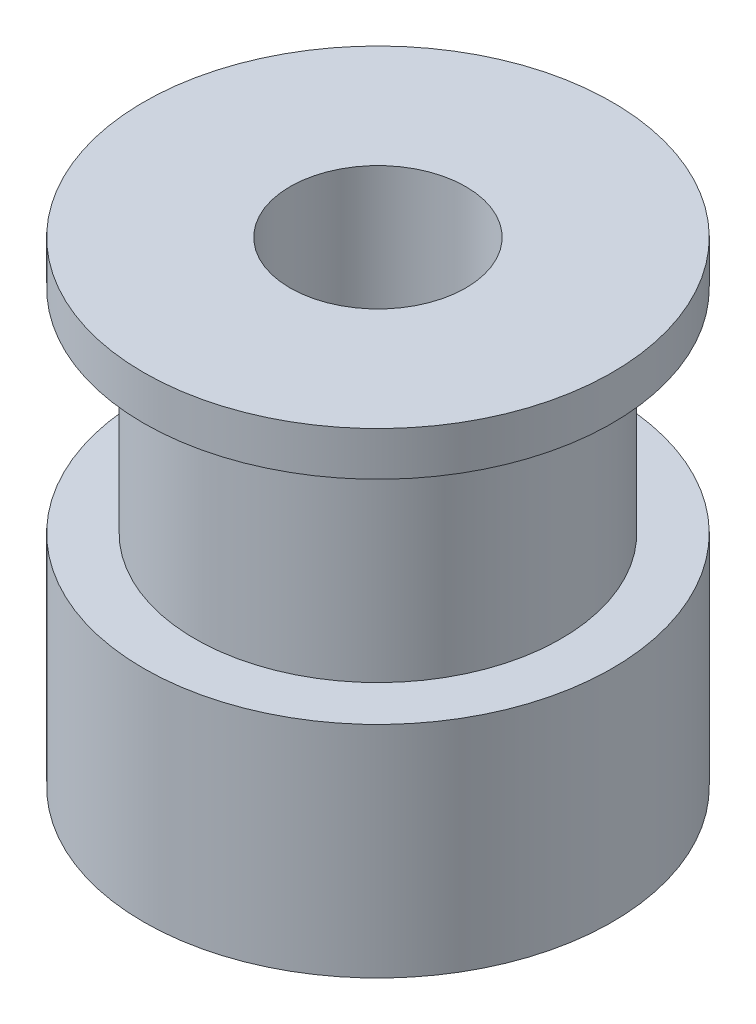
ISO-10303-21;
HEADER;
FILE_DESCRIPTION(('STEP AP214'),'2;1');
FILE_NAME('part.step','',(''),(''),'','','');
FILE_SCHEMA(('AUTOMOTIVE_DESIGN { 1 0 10303 214 1 1 1 1 }'));
ENDSEC;
DATA;
#1=APPLICATION_CONTEXT('core data for automotive mechanical design processes');
#2=APPLICATION_PROTOCOL_DEFINITION('international standard','automotive_design',2000,#1);
#3=PRODUCT_CONTEXT('',#1,'mechanical');
#4=PRODUCT('Part','Part','',(#3));
#5=PRODUCT_RELATED_PRODUCT_CATEGORY('part','',(#4));
#6=PRODUCT_DEFINITION_FORMATION('','',#4);
#7=PRODUCT_DEFINITION_CONTEXT('part definition',#1,'design');
#8=PRODUCT_DEFINITION('design','',#6,#7);
#9=PRODUCT_DEFINITION_SHAPE('','',#8);
#10=(LENGTH_UNIT() NAMED_UNIT(*) SI_UNIT(.MILLI.,.METRE.));
#11=(NAMED_UNIT(*) PLANE_ANGLE_UNIT() SI_UNIT($,.RADIAN.));
#12=(NAMED_UNIT(*) SI_UNIT($,.STERADIAN.) SOLID_ANGLE_UNIT());
#13=UNCERTAINTY_MEASURE_WITH_UNIT(LENGTH_MEASURE(1.E-05),#10,'distance_accuracy_value','');
#14=(GEOMETRIC_REPRESENTATION_CONTEXT(3) GLOBAL_UNCERTAINTY_ASSIGNED_CONTEXT((#13)) GLOBAL_UNIT_ASSIGNED_CONTEXT((#10,
#11,#12)) REPRESENTATION_CONTEXT('',''));
#15=CARTESIAN_POINT('',(0.,0.,0.));
#16=DIRECTION('',(0.,0.,1.));
#17=DIRECTION('',(1.,0.,0.));
#18=AXIS2_PLACEMENT_3D('',#15,#16,#17);
#19=CARTESIAN_POINT('',(0.,7.5,0.));
#20=DIRECTION('',(0.,1.,0.));
#21=DIRECTION('',(0.,0.,1.));
#22=AXIS2_PLACEMENT_3D('',#19,#20,#21);
#23=PLANE('',#22);
#24=CARTESIAN_POINT('',(0.,7.5,0.));
#25=DIRECTION('',(0.,1.,0.));
#26=DIRECTION('',(0.,0.,1.));
#27=AXIS2_PLACEMENT_3D('',#24,#25,#26);
#28=CIRCLE('',#27,6.25);
#29=CARTESIAN_POINT('',(0.,7.5,-6.25));
#30=VERTEX_POINT('',#29);
#31=EDGE_CURVE('E10',#30,#30,#28,.T.);
#32=ORIENTED_EDGE('',*,*,#31,.F.);
#33=EDGE_LOOP('',(#32));
#34=FACE_BOUND('',#33,.T.);
#35=CARTESIAN_POINT('',(0.,7.5,0.));
#36=DIRECTION('',(0.,1.,0.));
#37=DIRECTION('',(0.,0.,1.));
#38=AXIS2_PLACEMENT_3D('',#35,#36,#37);
#39=CIRCLE('',#38,8.);
#40=CARTESIAN_POINT('',(0.,7.5,8.));
#41=VERTEX_POINT('',#40);
#42=EDGE_CURVE('E46',#41,#41,#39,.T.);
#43=ORIENTED_EDGE('',*,*,#42,.T.);
#44=EDGE_LOOP('',(#43));
#45=FACE_BOUND('',#44,.T.);
#46=ADVANCED_FACE('F37',(#34,#45),#23,.T.);
#47=CARTESIAN_POINT('',(0.,0.,0.));
#48=DIRECTION('',(0.,1.,0.));
#49=DIRECTION('',(0.,0.,1.));
#50=AXIS2_PLACEMENT_3D('',#47,#48,#49);
#51=PLANE('',#50);
#52=CARTESIAN_POINT('',(0.,0.,0.));
#53=DIRECTION('',(0.,1.,0.));
#54=DIRECTION('',(0.,0.,1.));
#55=AXIS2_PLACEMENT_3D('',#52,#53,#54);
#56=CIRCLE('',#55,8.);
#57=CARTESIAN_POINT('',(0.,0.,8.));
#58=VERTEX_POINT('',#57);
#59=EDGE_CURVE('E41',#58,#58,#56,.T.);
#60=ORIENTED_EDGE('',*,*,#59,.F.);
#61=EDGE_LOOP('',(#60));
#62=FACE_BOUND('',#61,.T.);
#63=CARTESIAN_POINT('',(0.,0.,0.));
#64=DIRECTION('',(0.,1.,0.));
#65=DIRECTION('',(0.,0.,1.));
#66=AXIS2_PLACEMENT_3D('',#63,#64,#65);
#67=CIRCLE('',#66,3.);
#68=CARTESIAN_POINT('',(0.,0.,3.));
#69=VERTEX_POINT('',#68);
#70=EDGE_CURVE('E56',#69,#69,#67,.T.);
#71=ORIENTED_EDGE('',*,*,#70,.T.);
#72=EDGE_LOOP('',(#71));
#73=FACE_BOUND('',#72,.T.);
#74=ADVANCED_FACE('F98',(#62,#73),#51,.F.);
#75=CARTESIAN_POINT('',(0.,7.5,0.));
#76=DIRECTION('',(0.,-1.,0.));
#77=DIRECTION('',(0.,0.,-1.));
#78=AXIS2_PLACEMENT_3D('',#75,#76,#77);
#79=CYLINDRICAL_SURFACE('',#78,8.);
#80=ORIENTED_EDGE('',*,*,#42,.F.);
#81=EDGE_LOOP('',(#80));
#82=FACE_BOUND('',#81,.T.);
#83=ORIENTED_EDGE('',*,*,#59,.T.);
#84=EDGE_LOOP('',(#83));
#85=FACE_BOUND('',#84,.T.);
#86=ADVANCED_FACE('F39',(#82,#85),#79,.T.);
#87=CARTESIAN_POINT('',(0.,7.5,0.));
#88=DIRECTION('',(0.,-1.,0.));
#89=DIRECTION('',(0.,0.,-1.));
#90=AXIS2_PLACEMENT_3D('',#87,#88,#89);
#91=CYLINDRICAL_SURFACE('',#90,3.);
#92=ORIENTED_EDGE('',*,*,#70,.F.);
#93=EDGE_LOOP('',(#92));
#94=FACE_BOUND('',#93,.T.);
#95=CARTESIAN_POINT('',(0.,16.25,0.));
#96=DIRECTION('',(0.,1.,0.));
#97=DIRECTION('',(0.,0.,1.));
#98=AXIS2_PLACEMENT_3D('',#95,#96,#97);
#99=CIRCLE('',#98,3.);
#100=CARTESIAN_POINT('',(0.,16.25,3.));
#101=VERTEX_POINT('',#100);
#102=EDGE_CURVE('E76',#101,#101,#99,.T.);
#103=ORIENTED_EDGE('',*,*,#102,.T.);
#104=EDGE_LOOP('',(#103));
#105=FACE_BOUND('',#104,.T.);
#106=ADVANCED_FACE('F82',(#94,#105),#91,.F.);
#107=CARTESIAN_POINT('',(0.,14.75,0.));
#108=DIRECTION('',(0.,-1.,0.));
#109=DIRECTION('',(0.,0.,-1.));
#110=AXIS2_PLACEMENT_3D('',#107,#108,#109);
#111=CYLINDRICAL_SURFACE('',#110,6.25);
#112=CARTESIAN_POINT('',(0.,14.75,0.));
#113=DIRECTION('',(0.,1.,0.));
#114=DIRECTION('',(0.,0.,1.));
#115=AXIS2_PLACEMENT_3D('',#112,#113,#114);
#116=CIRCLE('',#115,6.25);
#117=CARTESIAN_POINT('',(0.,14.75,-6.25));
#118=VERTEX_POINT('',#117);
#119=EDGE_CURVE('E54',#118,#118,#116,.T.);
#120=CARTESIAN_POINT('',(0.,14.75,-6.25));
#121=CARTESIAN_POINT('',(0.,14.6744791666667,-6.25));
#122=CARTESIAN_POINT('',(0.,14.5989583333333,-6.25));
#123=CARTESIAN_POINT('',(0.,14.4479166666667,-6.25));
#124=CARTESIAN_POINT('',(0.,14.3723958333333,-6.25));
#125=CARTESIAN_POINT('',(0.,14.2213541666667,-6.25));
#126=CARTESIAN_POINT('',(0.,14.1458333333333,-6.25));
#127=CARTESIAN_POINT('',(0.,13.9947916666667,-6.25));
#128=CARTESIAN_POINT('',(0.,13.9192708333333,-6.25));
#129=CARTESIAN_POINT('',(0.,13.7682291666667,-6.25));
#130=CARTESIAN_POINT('',(0.,13.6927083333333,-6.25));
#131=CARTESIAN_POINT('',(0.,13.5416666666667,-6.25));
#132=CARTESIAN_POINT('',(0.,13.4661458333333,-6.25));
#133=CARTESIAN_POINT('',(0.,13.3151041666667,-6.25));
#134=CARTESIAN_POINT('',(0.,13.2395833333333,-6.25));
#135=CARTESIAN_POINT('',(0.,13.0885416666667,-6.25));
#136=CARTESIAN_POINT('',(0.,13.0130208333333,-6.25));
#137=CARTESIAN_POINT('',(0.,12.8619791666667,-6.25));
#138=CARTESIAN_POINT('',(0.,12.7864583333333,-6.25));
#139=CARTESIAN_POINT('',(0.,12.6354166666667,-6.25));
#140=CARTESIAN_POINT('',(0.,12.5598958333333,-6.25));
#141=CARTESIAN_POINT('',(0.,12.4088541666667,-6.25));
#142=CARTESIAN_POINT('',(0.,12.3333333333333,-6.25));
#143=CARTESIAN_POINT('',(0.,12.1822916666667,-6.25));
#144=CARTESIAN_POINT('',(0.,12.1067708333333,-6.25));
#145=CARTESIAN_POINT('',(0.,11.9557291666667,-6.25));
#146=CARTESIAN_POINT('',(0.,11.8802083333333,-6.25));
#147=CARTESIAN_POINT('',(0.,11.7291666666667,-6.25));
#148=CARTESIAN_POINT('',(0.,11.6536458333333,-6.25));
#149=CARTESIAN_POINT('',(0.,11.5026041666667,-6.25));
#150=CARTESIAN_POINT('',(0.,11.4270833333333,-6.25));
#151=CARTESIAN_POINT('',(0.,11.2760416666667,-6.25));
#152=CARTESIAN_POINT('',(0.,11.2005208333333,-6.25));
#153=CARTESIAN_POINT('',(0.,11.0494791666667,-6.25));
#154=CARTESIAN_POINT('',(0.,10.9739583333333,-6.25));
#155=CARTESIAN_POINT('',(0.,10.8229166666667,-6.25));
#156=CARTESIAN_POINT('',(0.,10.7473958333333,-6.25));
#157=CARTESIAN_POINT('',(0.,10.5963541666667,-6.25));
#158=CARTESIAN_POINT('',(0.,10.5208333333333,-6.25));
#159=CARTESIAN_POINT('',(0.,10.3697916666667,-6.25));
#160=CARTESIAN_POINT('',(0.,10.2942708333333,-6.25));
#161=CARTESIAN_POINT('',(0.,10.1432291666667,-6.25));
#162=CARTESIAN_POINT('',(0.,10.0677083333333,-6.25));
#163=CARTESIAN_POINT('',(0.,9.91666666666667,-6.25));
#164=CARTESIAN_POINT('',(0.,9.84114583333333,-6.25));
#165=CARTESIAN_POINT('',(0.,9.69010416666667,-6.25));
#166=CARTESIAN_POINT('',(0.,9.61458333333333,-6.25));
#167=CARTESIAN_POINT('',(0.,9.46354166666667,-6.25));
#168=CARTESIAN_POINT('',(0.,9.38802083333333,-6.25));
#169=CARTESIAN_POINT('',(0.,9.23697916666666,-6.25));
#170=CARTESIAN_POINT('',(0.,9.16145833333333,-6.25));
#171=CARTESIAN_POINT('',(0.,9.01041666666666,-6.25));
#172=CARTESIAN_POINT('',(0.,8.93489583333333,-6.25));
#173=CARTESIAN_POINT('',(0.,8.78385416666667,-6.25));
#174=CARTESIAN_POINT('',(0.,8.70833333333333,-6.25));
#175=CARTESIAN_POINT('',(0.,8.55729166666667,-6.25));
#176=CARTESIAN_POINT('',(0.,8.48177083333333,-6.25));
#177=CARTESIAN_POINT('',(0.,8.33072916666666,-6.25));
#178=CARTESIAN_POINT('',(0.,8.25520833333333,-6.25));
#179=CARTESIAN_POINT('',(0.,8.10416666666666,-6.25));
#180=CARTESIAN_POINT('',(0.,8.02864583333333,-6.25));
#181=CARTESIAN_POINT('',(0.,7.87760416666666,-6.25));
#182=CARTESIAN_POINT('',(0.,7.80208333333333,-6.25));
#183=CARTESIAN_POINT('',(0.,7.65104166666667,-6.25));
#184=CARTESIAN_POINT('',(0.,7.57552083333333,-6.25));
#185=CARTESIAN_POINT('',(0.,7.5,-6.25));
#186=B_SPLINE_CURVE_WITH_KNOTS('',3,(#120,#121,#122,#123,#124,#125,#126,#127,#128,#129,#130,
#131,#132,#133,#134,#135,#136,#137,#138,#139,#140,#141,#142,#143,#144,#145,#146,#147,#148,#149,
#150,#151,#152,#153,#154,#155,#156,#157,#158,#159,#160,#161,#162,#163,#164,#165,#166,#167,#168,
#169,#170,#171,#172,#173,#174,#175,#176,#177,#178,#179,#180,#181,#182,#183,#184,#185),
.UNSPECIFIED.,.F.,.F.,(4,2,2,2,2,2,2,2,2,2,2,2,2,2,2,2,2,2,2,2,2,2,2,2,2,2,2,2,2,2,2,2,4),(0.,
0.226562499999999,0.453124999999999,0.6796875,0.906249999999999,1.1328125,1.359375,1.5859375,
1.8125,2.0390625,2.265625,2.4921875,2.71875,2.9453125,3.171875,3.3984375,3.625,3.8515625,
4.078125,4.3046875,4.53125,4.7578125,4.984375,5.2109375,5.4375,5.6640625,5.890625,6.1171875,
6.34375,6.5703125,6.796875,7.0234375,7.25),.UNSPECIFIED.);
#187=EDGE_CURVE('BSEAM87',#118,#30,#186,.T.);
#188=ORIENTED_EDGE('',*,*,#119,.F.);
#189=ORIENTED_EDGE('',*,*,#31,.T.);
#190=ORIENTED_EDGE('',*,*,#187,.T.);
#191=ORIENTED_EDGE('',*,*,#187,.F.);
#192=EDGE_LOOP('',(#188,#190,#189,#191));
#193=FACE_BOUND('',#192,.T.);
#194=ADVANCED_FACE('F87',(#193),#111,.T.);
#195=CARTESIAN_POINT('',(0.,16.25,0.));
#196=DIRECTION('',(0.,1.,0.));
#197=DIRECTION('',(0.,0.,1.));
#198=AXIS2_PLACEMENT_3D('',#195,#196,#197);
#199=PLANE('',#198);
#200=CARTESIAN_POINT('',(0.,16.25,0.));
#201=DIRECTION('',(0.,1.,0.));
#202=DIRECTION('',(0.,0.,1.));
#203=AXIS2_PLACEMENT_3D('',#200,#201,#202);
#204=CIRCLE('',#203,8.);
#205=CARTESIAN_POINT('',(0.,16.25,8.));
#206=VERTEX_POINT('',#205);
#207=EDGE_CURVE('E65',#206,#206,#204,.T.);
#208=ORIENTED_EDGE('',*,*,#207,.T.);
#209=EDGE_LOOP('',(#208));
#210=FACE_BOUND('',#209,.T.);
#211=ORIENTED_EDGE('',*,*,#102,.F.);
#212=EDGE_LOOP('',(#211));
#213=FACE_BOUND('',#212,.T.);
#214=ADVANCED_FACE('F84',(#210,#213),#199,.T.);
#215=CARTESIAN_POINT('',(0.,14.75,0.));
#216=DIRECTION('',(0.,1.,0.));
#217=DIRECTION('',(0.,0.,1.));
#218=AXIS2_PLACEMENT_3D('',#215,#216,#217);
#219=PLANE('',#218);
#220=ORIENTED_EDGE('',*,*,#119,.T.);
#221=EDGE_LOOP('',(#220));
#222=FACE_BOUND('',#221,.T.);
#223=CARTESIAN_POINT('',(0.,14.75,0.));
#224=DIRECTION('',(0.,1.,0.));
#225=DIRECTION('',(0.,0.,1.));
#226=AXIS2_PLACEMENT_3D('',#223,#224,#225);
#227=CIRCLE('',#226,8.);
#228=CARTESIAN_POINT('',(0.,14.75,8.));
#229=VERTEX_POINT('',#228);
#230=EDGE_CURVE('E70',#229,#229,#227,.T.);
#231=ORIENTED_EDGE('',*,*,#230,.F.);
#232=EDGE_LOOP('',(#231));
#233=FACE_BOUND('',#232,.T.);
#234=ADVANCED_FACE('F86',(#222,#233),#219,.F.);
#235=CARTESIAN_POINT('',(0.,16.25,0.));
#236=DIRECTION('',(0.,-1.,0.));
#237=DIRECTION('',(0.,0.,-1.));
#238=AXIS2_PLACEMENT_3D('',#235,#236,#237);
#239=CYLINDRICAL_SURFACE('',#238,8.);
#240=ORIENTED_EDGE('',*,*,#207,.F.);
#241=EDGE_LOOP('',(#240));
#242=FACE_BOUND('',#241,.T.);
#243=ORIENTED_EDGE('',*,*,#230,.T.);
#244=EDGE_LOOP('',(#243));
#245=FACE_BOUND('',#244,.T.);
#246=ADVANCED_FACE('F93',(#242,#245),#239,.T.);
#247=CLOSED_SHELL('',(#46,#74,#86,#106,#194,#214,#234,#246));
#248=MANIFOLD_SOLID_BREP('B2',#247);
#249=ADVANCED_BREP_SHAPE_REPRESENTATION('',(#18,#248),#14);
#250=SHAPE_DEFINITION_REPRESENTATION(#9,#249);
ENDSEC;
END-ISO-10303-21;
